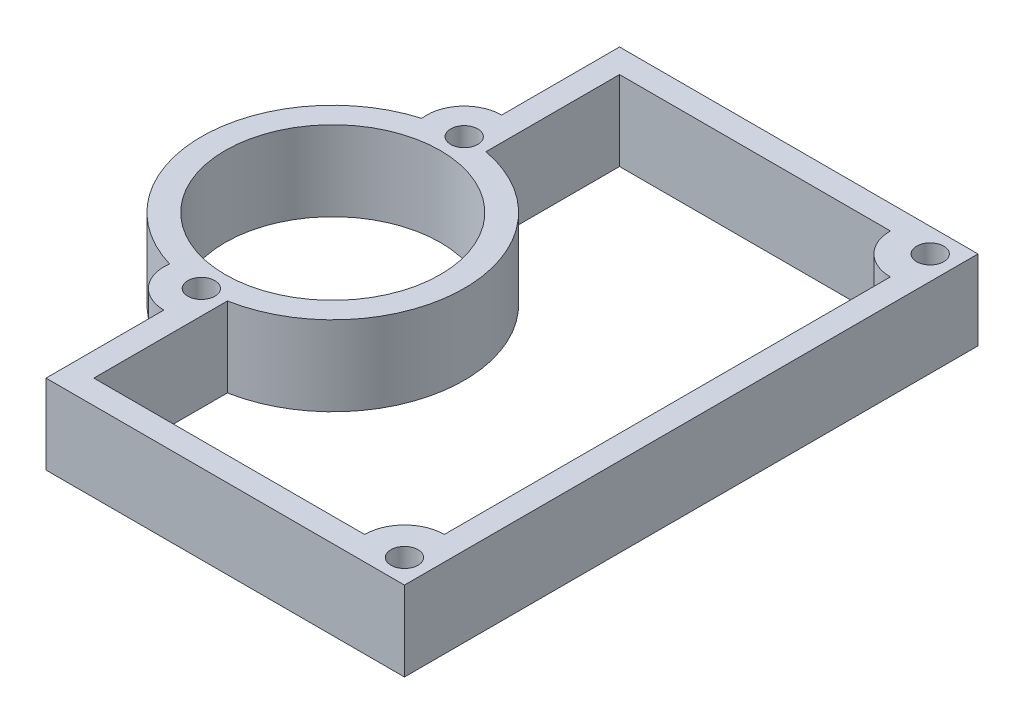
ISO-10303-21;
HEADER;
FILE_DESCRIPTION(('STEP AP214'),'2;1');
FILE_NAME('part.step','',(''),(''),'','','');
FILE_SCHEMA(('AUTOMOTIVE_DESIGN { 1 0 10303 214 1 1 1 1 }'));
ENDSEC;
DATA;
#1=APPLICATION_CONTEXT('core data for automotive mechanical design processes');
#2=APPLICATION_PROTOCOL_DEFINITION('international standard','automotive_design',2000,#1);
#3=PRODUCT_CONTEXT('',#1,'mechanical');
#4=PRODUCT('Part','Part','',(#3));
#5=PRODUCT_RELATED_PRODUCT_CATEGORY('part','',(#4));
#6=PRODUCT_DEFINITION_FORMATION('','',#4);
#7=PRODUCT_DEFINITION_CONTEXT('part definition',#1,'design');
#8=PRODUCT_DEFINITION('design','',#6,#7);
#9=PRODUCT_DEFINITION_SHAPE('','',#8);
#10=(LENGTH_UNIT() NAMED_UNIT(*) SI_UNIT(.MILLI.,.METRE.));
#11=(NAMED_UNIT(*) PLANE_ANGLE_UNIT() SI_UNIT($,.RADIAN.));
#12=(NAMED_UNIT(*) SI_UNIT($,.STERADIAN.) SOLID_ANGLE_UNIT());
#13=UNCERTAINTY_MEASURE_WITH_UNIT(LENGTH_MEASURE(1.E-05),#10,'distance_accuracy_value','');
#14=(GEOMETRIC_REPRESENTATION_CONTEXT(3) GLOBAL_UNCERTAINTY_ASSIGNED_CONTEXT((#13)) GLOBAL_UNIT_ASSIGNED_CONTEXT((#10,
#11,#12)) REPRESENTATION_CONTEXT('',''));
#15=CARTESIAN_POINT('',(0.,0.,0.));
#16=DIRECTION('',(0.,0.,1.));
#17=DIRECTION('',(1.,0.,0.));
#18=AXIS2_PLACEMENT_3D('',#15,#16,#17);
#19=CARTESIAN_POINT('',(0.,10.,16.5));
#20=DIRECTION('',(0.,-1.,0.));
#21=DIRECTION('',(0.,0.,-1.));
#22=AXIS2_PLACEMENT_3D('',#19,#20,#21);
#23=CYLINDRICAL_SURFACE('',#22,4.7);
#24=CARTESIAN_POINT('',(0.,0.,16.5));
#25=DIRECTION('',(0.,1.,0.));
#26=DIRECTION('',(0.,0.,1.));
#27=AXIS2_PLACEMENT_3D('',#24,#25,#26);
#28=CIRCLE('',#27,4.7);
#29=CARTESIAN_POINT('',(-4.65208681710722,0.,15.8306060606061));
#30=VERTEX_POINT('',#29);
#31=CARTESIAN_POINT('',(0.,0.,21.2));
#32=VERTEX_POINT('',#31);
#33=EDGE_CURVE('E220',#30,#32,#28,.T.);
#34=ORIENTED_EDGE('',*,*,#33,.T.);
#35=DIRECTION('',(0.,-1.,0.));
#36=VECTOR('',#35,1.);
#37=CARTESIAN_POINT('',(0.,10.,21.2));
#38=LINE('',#37,#36);
#39=CARTESIAN_POINT('',(0.,10.,21.2));
#40=VERTEX_POINT('',#39);
#41=EDGE_CURVE('E11',#40,#32,#38,.T.);
#42=ORIENTED_EDGE('',*,*,#41,.F.);
#43=CARTESIAN_POINT('',(0.,10.,16.5));
#44=DIRECTION('',(0.,1.,0.));
#45=DIRECTION('',(0.,0.,1.));
#46=AXIS2_PLACEMENT_3D('',#43,#44,#45);
#47=CIRCLE('',#46,4.7);
#48=CARTESIAN_POINT('',(-4.65208681710722,10.,15.8306060606061));
#49=VERTEX_POINT('',#48);
#50=EDGE_CURVE('E227',#49,#40,#47,.T.);
#51=ORIENTED_EDGE('',*,*,#50,.F.);
#52=DIRECTION('',(0.,-1.,0.));
#53=VECTOR('',#52,1.);
#54=CARTESIAN_POINT('',(-4.65208681710722,10.,15.8306060606061));
#55=LINE('',#54,#53);
#56=EDGE_CURVE('E268',#49,#30,#55,.T.);
#57=ORIENTED_EDGE('',*,*,#56,.T.);
#58=EDGE_LOOP('',(#34,#42,#51,#57));
#59=FACE_BOUND('',#58,.T.);
#60=ADVANCED_FACE('F42',(#59),#23,.T.);
#61=CARTESIAN_POINT('',(0.,10.,0.));
#62=DIRECTION('',(1.,0.,0.));
#63=DIRECTION('',(0.,0.,-1.));
#64=AXIS2_PLACEMENT_3D('',#61,#62,#63);
#65=PLANE('',#64);
#66=DIRECTION('',(0.,0.,1.));
#67=VECTOR('',#66,1.);
#68=CARTESIAN_POINT('',(0.,0.,0.));
#69=LINE('',#68,#67);
#70=CARTESIAN_POINT('',(0.,0.,36.));
#71=VERTEX_POINT('',#70);
#72=EDGE_CURVE('E272',#32,#71,#69,.T.);
#73=ORIENTED_EDGE('',*,*,#72,.T.);
#74=DIRECTION('',(0.,-1.,0.));
#75=VECTOR('',#74,1.);
#76=CARTESIAN_POINT('',(0.,10.,36.));
#77=LINE('',#76,#75);
#78=CARTESIAN_POINT('',(0.,10.,36.));
#79=VERTEX_POINT('',#78);
#80=EDGE_CURVE('E50',#79,#71,#77,.T.);
#81=ORIENTED_EDGE('',*,*,#80,.F.);
#82=DIRECTION('',(0.,0.,1.));
#83=VECTOR('',#82,1.);
#84=CARTESIAN_POINT('',(0.,10.,0.));
#85=LINE('',#84,#83);
#86=EDGE_CURVE('E231',#40,#79,#85,.T.);
#87=ORIENTED_EDGE('',*,*,#86,.F.);
#88=ORIENTED_EDGE('',*,*,#41,.T.);
#89=EDGE_LOOP('',(#73,#81,#87,#88));
#90=FACE_BOUND('',#89,.T.);
#91=ADVANCED_FACE('F351',(#90),#65,.F.);
#92=CARTESIAN_POINT('',(0.,10.,36.));
#93=DIRECTION('',(0.,0.,-1.));
#94=DIRECTION('',(-1.,0.,0.));
#95=AXIS2_PLACEMENT_3D('',#92,#93,#94);
#96=PLANE('',#95);
#97=DIRECTION('',(1.,0.,0.));
#98=VECTOR('',#97,1.);
#99=CARTESIAN_POINT('',(0.,0.,36.));
#100=LINE('',#99,#98);
#101=CARTESIAN_POINT('',(45.,0.,36.));
#102=VERTEX_POINT('',#101);
#103=EDGE_CURVE('E275',#71,#102,#100,.T.);
#104=ORIENTED_EDGE('',*,*,#103,.T.);
#105=DIRECTION('',(0.,-1.,0.));
#106=VECTOR('',#105,1.);
#107=CARTESIAN_POINT('',(45.,10.,36.));
#108=LINE('',#107,#106);
#109=CARTESIAN_POINT('',(45.,10.,36.));
#110=VERTEX_POINT('',#109);
#111=EDGE_CURVE('E323',#110,#102,#108,.T.);
#112=ORIENTED_EDGE('',*,*,#111,.F.);
#113=DIRECTION('',(1.,0.,0.));
#114=VECTOR('',#113,1.);
#115=CARTESIAN_POINT('',(0.,10.,36.));
#116=LINE('',#115,#114);
#117=EDGE_CURVE('E235',#79,#110,#116,.T.);
#118=ORIENTED_EDGE('',*,*,#117,.F.);
#119=ORIENTED_EDGE('',*,*,#80,.T.);
#120=EDGE_LOOP('',(#104,#112,#118,#119));
#121=FACE_BOUND('',#120,.T.);
#122=ADVANCED_FACE('F333',(#121),#96,.F.);
#123=CARTESIAN_POINT('',(45.,10.,0.));
#124=DIRECTION('',(-1.,0.,0.));
#125=DIRECTION('',(0.,0.,1.));
#126=AXIS2_PLACEMENT_3D('',#123,#124,#125);
#127=PLANE('',#126);
#128=DIRECTION('',(0.,0.,-1.));
#129=VECTOR('',#128,1.);
#130=CARTESIAN_POINT('',(45.,0.,0.));
#131=LINE('',#130,#129);
#132=CARTESIAN_POINT('',(45.,0.,-36.));
#133=VERTEX_POINT('',#132);
#134=EDGE_CURVE('E278',#102,#133,#131,.T.);
#135=ORIENTED_EDGE('',*,*,#134,.T.);
#136=DIRECTION('',(0.,-1.,0.));
#137=VECTOR('',#136,1.);
#138=CARTESIAN_POINT('',(45.,10.,-36.));
#139=LINE('',#138,#137);
#140=CARTESIAN_POINT('',(45.,10.,-36.));
#141=VERTEX_POINT('',#140);
#142=EDGE_CURVE('E320',#141,#133,#139,.T.);
#143=ORIENTED_EDGE('',*,*,#142,.F.);
#144=DIRECTION('',(0.,0.,-1.));
#145=VECTOR('',#144,1.);
#146=CARTESIAN_POINT('',(45.,10.,0.));
#147=LINE('',#146,#145);
#148=EDGE_CURVE('E238',#110,#141,#147,.T.);
#149=ORIENTED_EDGE('',*,*,#148,.F.);
#150=ORIENTED_EDGE('',*,*,#111,.T.);
#151=EDGE_LOOP('',(#135,#143,#149,#150));
#152=FACE_BOUND('',#151,.T.);
#153=ADVANCED_FACE('F342',(#152),#127,.F.);
#154=CARTESIAN_POINT('',(0.,10.,-36.));
#155=DIRECTION('',(0.,0.,-1.));
#156=DIRECTION('',(-1.,0.,0.));
#157=AXIS2_PLACEMENT_3D('',#154,#155,#156);
#158=PLANE('',#157);
#159=DIRECTION('',(1.,0.,0.));
#160=VECTOR('',#159,1.);
#161=CARTESIAN_POINT('',(0.,0.,-36.));
#162=LINE('',#161,#160);
#163=CARTESIAN_POINT('',(0.,0.,-36.));
#164=VERTEX_POINT('',#163);
#165=EDGE_CURVE('E282',#164,#133,#162,.T.);
#166=ORIENTED_EDGE('',*,*,#165,.F.);
#167=DIRECTION('',(0.,-1.,0.));
#168=VECTOR('',#167,1.);
#169=CARTESIAN_POINT('',(0.,10.,-36.));
#170=LINE('',#169,#168);
#171=CARTESIAN_POINT('',(0.,10.,-36.));
#172=VERTEX_POINT('',#171);
#173=EDGE_CURVE('E317',#172,#164,#170,.T.);
#174=ORIENTED_EDGE('',*,*,#173,.F.);
#175=DIRECTION('',(1.,0.,0.));
#176=VECTOR('',#175,1.);
#177=CARTESIAN_POINT('',(0.,10.,-36.));
#178=LINE('',#177,#176);
#179=EDGE_CURVE('E241',#172,#141,#178,.T.);
#180=ORIENTED_EDGE('',*,*,#179,.T.);
#181=ORIENTED_EDGE('',*,*,#142,.T.);
#182=EDGE_LOOP('',(#166,#174,#180,#181));
#183=FACE_BOUND('',#182,.T.);
#184=ADVANCED_FACE('F365',(#183),#158,.T.);
#185=CARTESIAN_POINT('',(0.,10.,0.));
#186=DIRECTION('',(-1.,0.,0.));
#187=DIRECTION('',(0.,0.,1.));
#188=AXIS2_PLACEMENT_3D('',#185,#186,#187);
#189=PLANE('',#188);
#190=DIRECTION('',(0.,0.,-1.));
#191=VECTOR('',#190,1.);
#192=CARTESIAN_POINT('',(0.,0.,0.));
#193=LINE('',#192,#191);
#194=CARTESIAN_POINT('',(0.,0.,-21.2));
#195=VERTEX_POINT('',#194);
#196=EDGE_CURVE('E286',#195,#164,#193,.T.);
#197=ORIENTED_EDGE('',*,*,#196,.F.);
#198=DIRECTION('',(0.,-1.,0.));
#199=VECTOR('',#198,1.);
#200=CARTESIAN_POINT('',(0.,10.,-21.2));
#201=LINE('',#200,#199);
#202=CARTESIAN_POINT('',(0.,10.,-21.2));
#203=VERTEX_POINT('',#202);
#204=EDGE_CURVE('E314',#203,#195,#201,.T.);
#205=ORIENTED_EDGE('',*,*,#204,.F.);
#206=DIRECTION('',(0.,0.,-1.));
#207=VECTOR('',#206,1.);
#208=CARTESIAN_POINT('',(0.,10.,0.));
#209=LINE('',#208,#207);
#210=EDGE_CURVE('E245',#203,#172,#209,.T.);
#211=ORIENTED_EDGE('',*,*,#210,.T.);
#212=ORIENTED_EDGE('',*,*,#173,.T.);
#213=EDGE_LOOP('',(#197,#205,#211,#212));
#214=FACE_BOUND('',#213,.T.);
#215=ADVANCED_FACE('F363',(#214),#189,.T.);
#216=CARTESIAN_POINT('',(0.,10.,-16.5));
#217=DIRECTION('',(0.,-1.,0.));
#218=DIRECTION('',(0.,0.,-1.));
#219=AXIS2_PLACEMENT_3D('',#216,#217,#218);
#220=CYLINDRICAL_SURFACE('',#219,4.7);
#221=CARTESIAN_POINT('',(0.,0.,-16.5));
#222=DIRECTION('',(0.,1.,0.));
#223=DIRECTION('',(0.,0.,1.));
#224=AXIS2_PLACEMENT_3D('',#221,#222,#223);
#225=CIRCLE('',#224,4.7);
#226=CARTESIAN_POINT('',(-4.6520868171072,0.,-15.8306060606061));
#227=VERTEX_POINT('',#226);
#228=EDGE_CURVE('E290',#227,#195,#225,.F.);
#229=ORIENTED_EDGE('',*,*,#228,.F.);
#230=DIRECTION('',(0.,-1.,0.));
#231=VECTOR('',#230,1.);
#232=CARTESIAN_POINT('',(-4.6520868171072,10.,-15.8306060606061));
#233=LINE('',#232,#231);
#234=CARTESIAN_POINT('',(-4.6520868171072,10.,-15.8306060606061));
#235=VERTEX_POINT('',#234);
#236=EDGE_CURVE('E311',#235,#227,#233,.T.);
#237=ORIENTED_EDGE('',*,*,#236,.F.);
#238=CARTESIAN_POINT('',(0.,10.,-16.5));
#239=DIRECTION('',(0.,1.,0.));
#240=DIRECTION('',(0.,0.,1.));
#241=AXIS2_PLACEMENT_3D('',#238,#239,#240);
#242=CIRCLE('',#241,4.7);
#243=EDGE_CURVE('E249',#235,#203,#242,.F.);
#244=ORIENTED_EDGE('',*,*,#243,.T.);
#245=ORIENTED_EDGE('',*,*,#204,.T.);
#246=EDGE_LOOP('',(#229,#237,#244,#245));
#247=FACE_BOUND('',#246,.T.);
#248=ADVANCED_FACE('F358',(#247),#220,.T.);
#249=CARTESIAN_POINT('',(0.,10.,16.5));
#250=DIRECTION('',(0.,-1.,0.));
#251=DIRECTION('',(0.,0.,-1.));
#252=AXIS2_PLACEMENT_3D('',#249,#250,#251);
#253=CYLINDRICAL_SURFACE('',#252,1.7);
#254=CARTESIAN_POINT('',(0.,10.,16.5));
#255=DIRECTION('',(0.,1.,0.));
#256=DIRECTION('',(0.,0.,1.));
#257=AXIS2_PLACEMENT_3D('',#254,#255,#256);
#258=CIRCLE('',#257,1.7);
#259=CARTESIAN_POINT('',(0.,10.,18.2));
#260=VERTEX_POINT('',#259);
#261=EDGE_CURVE('E260',#260,#260,#258,.F.);
#262=ORIENTED_EDGE('',*,*,#261,.F.);
#263=EDGE_LOOP('',(#262));
#264=FACE_BOUND('',#263,.T.);
#265=CARTESIAN_POINT('',(0.,0.,16.5));
#266=DIRECTION('',(0.,1.,0.));
#267=DIRECTION('',(0.,0.,1.));
#268=AXIS2_PLACEMENT_3D('',#265,#266,#267);
#269=CIRCLE('',#268,1.7);
#270=CARTESIAN_POINT('',(0.,0.,18.2));
#271=VERTEX_POINT('',#270);
#272=EDGE_CURVE('E301',#271,#271,#269,.F.);
#273=ORIENTED_EDGE('',*,*,#272,.T.);
#274=EDGE_LOOP('',(#273));
#275=FACE_BOUND('',#274,.T.);
#276=ADVANCED_FACE('F401',(#264,#275),#253,.F.);
#277=CARTESIAN_POINT('',(0.,10.,-16.5));
#278=DIRECTION('',(0.,-1.,0.));
#279=DIRECTION('',(0.,0.,-1.));
#280=AXIS2_PLACEMENT_3D('',#277,#278,#279);
#281=CYLINDRICAL_SURFACE('',#280,1.7);
#282=CARTESIAN_POINT('',(0.,10.,-16.5));
#283=DIRECTION('',(0.,1.,0.));
#284=DIRECTION('',(0.,0.,1.));
#285=AXIS2_PLACEMENT_3D('',#282,#283,#284);
#286=CIRCLE('',#285,1.7);
#287=CARTESIAN_POINT('',(0.,10.,-14.8));
#288=VERTEX_POINT('',#287);
#289=EDGE_CURVE('E256',#288,#288,#286,.T.);
#290=ORIENTED_EDGE('',*,*,#289,.T.);
#291=EDGE_LOOP('',(#290));
#292=FACE_BOUND('',#291,.T.);
#293=CARTESIAN_POINT('',(0.,0.,-16.5));
#294=DIRECTION('',(0.,1.,0.));
#295=DIRECTION('',(0.,0.,1.));
#296=AXIS2_PLACEMENT_3D('',#293,#294,#295);
#297=CIRCLE('',#296,1.7);
#298=CARTESIAN_POINT('',(0.,0.,-14.8));
#299=VERTEX_POINT('',#298);
#300=EDGE_CURVE('E297',#299,#299,#297,.T.);
#301=ORIENTED_EDGE('',*,*,#300,.F.);
#302=EDGE_LOOP('',(#301));
#303=FACE_BOUND('',#302,.T.);
#304=ADVANCED_FACE('F411',(#292,#303),#281,.F.);
#305=CARTESIAN_POINT('',(0.,10.,0.));
#306=DIRECTION('',(0.,-1.,0.));
#307=DIRECTION('',(0.,0.,-1.));
#308=AXIS2_PLACEMENT_3D('',#305,#306,#307);
#309=CYLINDRICAL_SURFACE('',#308,16.5);
#310=CARTESIAN_POINT('',(0.,0.,0.));
#311=DIRECTION('',(0.,1.,0.));
#312=DIRECTION('',(0.,0.,1.));
#313=AXIS2_PLACEMENT_3D('',#310,#311,#312);
#314=CIRCLE('',#313,16.5);
#315=EDGE_CURVE('E294',#227,#30,#314,.T.);
#316=ORIENTED_EDGE('',*,*,#315,.T.);
#317=ORIENTED_EDGE('',*,*,#56,.F.);
#318=CARTESIAN_POINT('',(0.,10.,0.));
#319=DIRECTION('',(0.,1.,0.));
#320=DIRECTION('',(0.,0.,1.));
#321=AXIS2_PLACEMENT_3D('',#318,#319,#320);
#322=CIRCLE('',#321,16.5);
#323=EDGE_CURVE('E253',#235,#49,#322,.T.);
#324=ORIENTED_EDGE('',*,*,#323,.F.);
#325=ORIENTED_EDGE('',*,*,#236,.T.);
#326=EDGE_LOOP('',(#316,#317,#324,#325));
#327=FACE_BOUND('',#326,.T.);
#328=ADVANCED_FACE('F419',(#327),#309,.T.);
#329=CARTESIAN_POINT('',(0.,10.,0.));
#330=DIRECTION('',(0.,-1.,0.));
#331=DIRECTION('',(0.,0.,-1.));
#332=AXIS2_PLACEMENT_3D('',#329,#330,#331);
#333=CYLINDRICAL_SURFACE('',#332,13.5);
#334=CARTESIAN_POINT('',(0.,10.,0.));
#335=DIRECTION('',(0.,1.,0.));
#336=DIRECTION('',(0.,0.,1.));
#337=AXIS2_PLACEMENT_3D('',#334,#335,#336);
#338=CIRCLE('',#337,13.5);
#339=CARTESIAN_POINT('',(0.,10.,13.5));
#340=VERTEX_POINT('',#339);
#341=EDGE_CURVE('E264',#340,#340,#338,.T.);
#342=ORIENTED_EDGE('',*,*,#341,.T.);
#343=EDGE_LOOP('',(#342));
#344=FACE_BOUND('',#343,.T.);
#345=CARTESIAN_POINT('',(0.,0.,0.));
#346=DIRECTION('',(0.,1.,0.));
#347=DIRECTION('',(0.,0.,1.));
#348=AXIS2_PLACEMENT_3D('',#345,#346,#347);
#349=CIRCLE('',#348,13.5);
#350=CARTESIAN_POINT('',(0.,0.,13.5));
#351=VERTEX_POINT('',#350);
#352=EDGE_CURVE('E232',#351,#351,#349,.T.);
#353=ORIENTED_EDGE('',*,*,#352,.F.);
#354=EDGE_LOOP('',(#353));
#355=FACE_BOUND('',#354,.T.);
#356=ADVANCED_FACE('F424',(#344,#355),#333,.F.);
#357=CARTESIAN_POINT('',(0.,10.,0.));
#358=DIRECTION('',(0.,1.,0.));
#359=DIRECTION('',(0.,0.,1.));
#360=AXIS2_PLACEMENT_3D('',#357,#358,#359);
#361=PLANE('',#360);
#362=CARTESIAN_POINT('',(42.,10.,-33.));
#363=DIRECTION('',(0.,1.,0.));
#364=DIRECTION('',(0.,0.,1.));
#365=AXIS2_PLACEMENT_3D('',#362,#363,#364);
#366=CIRCLE('',#365,1.7);
#367=CARTESIAN_POINT('',(42.,10.,-31.3));
#368=VERTEX_POINT('',#367);
#369=EDGE_CURVE('E654',#368,#368,#366,.T.);
#370=ORIENTED_EDGE('',*,*,#369,.F.);
#371=EDGE_LOOP('',(#370));
#372=FACE_BOUND('',#371,.T.);
#373=CARTESIAN_POINT('',(42.,10.,33.));
#374=DIRECTION('',(0.,1.,0.));
#375=DIRECTION('',(0.,0.,1.));
#376=AXIS2_PLACEMENT_3D('',#373,#374,#375);
#377=CIRCLE('',#376,1.7);
#378=CARTESIAN_POINT('',(42.,10.,34.7));
#379=VERTEX_POINT('',#378);
#380=EDGE_CURVE('E658',#379,#379,#377,.T.);
#381=ORIENTED_EDGE('',*,*,#380,.F.);
#382=EDGE_LOOP('',(#381));
#383=FACE_BOUND('',#382,.T.);
#384=DIRECTION('',(-1.,0.,0.));
#385=VECTOR('',#384,1.);
#386=CARTESIAN_POINT('',(3.,10.,-33.));
#387=LINE('',#386,#385);
#388=CARTESIAN_POINT('',(37.,10.,-33.));
#389=VERTEX_POINT('',#388);
#390=CARTESIAN_POINT('',(3.,10.,-33.));
#391=VERTEX_POINT('',#390);
#392=EDGE_CURVE('E187',#389,#391,#387,.T.);
#393=ORIENTED_EDGE('',*,*,#392,.F.);
#394=CARTESIAN_POINT('',(42.,10.,-33.));
#395=DIRECTION('',(0.,1.,0.));
#396=DIRECTION('',(0.,0.,1.));
#397=AXIS2_PLACEMENT_3D('',#394,#395,#396);
#398=CIRCLE('',#397,5.);
#399=CARTESIAN_POINT('',(42.,10.,-28.));
#400=VERTEX_POINT('',#399);
#401=EDGE_CURVE('E663',#389,#400,#398,.T.);
#402=ORIENTED_EDGE('',*,*,#401,.T.);
#403=DIRECTION('',(0.,0.,-1.));
#404=VECTOR('',#403,1.);
#405=CARTESIAN_POINT('',(42.,10.,-33.));
#406=LINE('',#405,#404);
#407=CARTESIAN_POINT('',(42.,10.,28.));
#408=VERTEX_POINT('',#407);
#409=EDGE_CURVE('E212',#408,#400,#406,.T.);
#410=ORIENTED_EDGE('',*,*,#409,.F.);
#411=CARTESIAN_POINT('',(42.,10.,33.));
#412=DIRECTION('',(0.,1.,0.));
#413=DIRECTION('',(0.,0.,-1.));
#414=AXIS2_PLACEMENT_3D('',#411,#412,#413);
#415=CIRCLE('',#414,5.);
#416=CARTESIAN_POINT('',(37.,10.,33.));
#417=VERTEX_POINT('',#416);
#418=EDGE_CURVE('E681',#408,#417,#415,.T.);
#419=ORIENTED_EDGE('',*,*,#418,.T.);
#420=DIRECTION('',(1.,0.,0.));
#421=VECTOR('',#420,1.);
#422=CARTESIAN_POINT('',(42.,10.,33.));
#423=LINE('',#422,#421);
#424=CARTESIAN_POINT('',(3.,10.,33.));
#425=VERTEX_POINT('',#424);
#426=EDGE_CURVE('E209',#425,#417,#423,.T.);
#427=ORIENTED_EDGE('',*,*,#426,.F.);
#428=DIRECTION('',(0.,0.,1.));
#429=VECTOR('',#428,1.);
#430=CARTESIAN_POINT('',(3.,10.,33.));
#431=LINE('',#430,#429);
#432=CARTESIAN_POINT('',(3.,10.,16.224980739588));
#433=VERTEX_POINT('',#432);
#434=EDGE_CURVE('E205',#433,#425,#431,.T.);
#435=ORIENTED_EDGE('',*,*,#434,.F.);
#436=CARTESIAN_POINT('',(0.,10.,0.));
#437=DIRECTION('',(0.,-1.,0.));
#438=DIRECTION('',(0.,0.,-1.));
#439=AXIS2_PLACEMENT_3D('',#436,#437,#438);
#440=CIRCLE('',#439,16.5);
#441=CARTESIAN_POINT('',(3.,10.,-16.2249807395879));
#442=VERTEX_POINT('',#441);
#443=EDGE_CURVE('E160',#442,#433,#440,.T.);
#444=ORIENTED_EDGE('',*,*,#443,.F.);
#445=DIRECTION('',(0.,0.,1.));
#446=VECTOR('',#445,1.);
#447=CARTESIAN_POINT('',(3.,10.,-16.2249807395879));
#448=LINE('',#447,#446);
#449=EDGE_CURVE('E182',#391,#442,#448,.T.);
#450=ORIENTED_EDGE('',*,*,#449,.F.);
#451=EDGE_LOOP('',(#393,#402,#410,#419,#427,#435,#444,#450));
#452=FACE_BOUND('',#451,.T.);
#453=ORIENTED_EDGE('',*,*,#50,.T.);
#454=ORIENTED_EDGE('',*,*,#86,.T.);
#455=ORIENTED_EDGE('',*,*,#117,.T.);
#456=ORIENTED_EDGE('',*,*,#148,.T.);
#457=ORIENTED_EDGE('',*,*,#179,.F.);
#458=ORIENTED_EDGE('',*,*,#210,.F.);
#459=ORIENTED_EDGE('',*,*,#243,.F.);
#460=ORIENTED_EDGE('',*,*,#323,.T.);
#461=EDGE_LOOP('',(#453,#454,#455,#456,#457,#458,#459,#460));
#462=FACE_BOUND('',#461,.T.);
#463=ORIENTED_EDGE('',*,*,#289,.F.);
#464=EDGE_LOOP('',(#463));
#465=FACE_BOUND('',#464,.T.);
#466=ORIENTED_EDGE('',*,*,#261,.T.);
#467=EDGE_LOOP('',(#466));
#468=FACE_BOUND('',#467,.T.);
#469=ORIENTED_EDGE('',*,*,#341,.F.);
#470=EDGE_LOOP('',(#469));
#471=FACE_BOUND('',#470,.T.);
#472=ADVANCED_FACE('F346',(#372,#383,#452,#462,#465,#468,#471),#361,.T.);
#473=CARTESIAN_POINT('',(0.,0.,0.));
#474=DIRECTION('',(0.,1.,0.));
#475=DIRECTION('',(0.,0.,1.));
#476=AXIS2_PLACEMENT_3D('',#473,#474,#475);
#477=PLANE('',#476);
#478=CARTESIAN_POINT('',(42.,0.,-33.));
#479=DIRECTION('',(0.,1.,0.));
#480=DIRECTION('',(0.,0.,1.));
#481=AXIS2_PLACEMENT_3D('',#478,#479,#480);
#482=CIRCLE('',#481,1.7);
#483=CARTESIAN_POINT('',(42.,0.,-31.3));
#484=VERTEX_POINT('',#483);
#485=EDGE_CURVE('E669',#484,#484,#482,.T.);
#486=ORIENTED_EDGE('',*,*,#485,.T.);
#487=EDGE_LOOP('',(#486));
#488=FACE_BOUND('',#487,.T.);
#489=CARTESIAN_POINT('',(42.,0.,33.));
#490=DIRECTION('',(0.,1.,0.));
#491=DIRECTION('',(0.,0.,1.));
#492=AXIS2_PLACEMENT_3D('',#489,#490,#491);
#493=CIRCLE('',#492,1.7);
#494=CARTESIAN_POINT('',(42.,0.,34.7));
#495=VERTEX_POINT('',#494);
#496=EDGE_CURVE('E712',#495,#495,#493,.T.);
#497=ORIENTED_EDGE('',*,*,#496,.T.);
#498=EDGE_LOOP('',(#497));
#499=FACE_BOUND('',#498,.T.);
#500=CARTESIAN_POINT('',(42.,0.,-33.));
#501=DIRECTION('',(0.,1.,0.));
#502=DIRECTION('',(0.,0.,1.));
#503=AXIS2_PLACEMENT_3D('',#500,#501,#502);
#504=CIRCLE('',#503,5.);
#505=CARTESIAN_POINT('',(37.,0.,-33.));
#506=VERTEX_POINT('',#505);
#507=CARTESIAN_POINT('',(42.,0.,-28.));
#508=VERTEX_POINT('',#507);
#509=EDGE_CURVE('E668',#506,#508,#504,.T.);
#510=ORIENTED_EDGE('',*,*,#509,.F.);
#511=DIRECTION('',(-1.,0.,0.));
#512=VECTOR('',#511,1.);
#513=CARTESIAN_POINT('',(3.,0.,-33.));
#514=LINE('',#513,#512);
#515=CARTESIAN_POINT('',(3.,0.,-33.));
#516=VERTEX_POINT('',#515);
#517=EDGE_CURVE('E57',#506,#516,#514,.T.);
#518=ORIENTED_EDGE('',*,*,#517,.T.);
#519=DIRECTION('',(0.,0.,1.));
#520=VECTOR('',#519,1.);
#521=CARTESIAN_POINT('',(3.,0.,-16.2249807395879));
#522=LINE('',#521,#520);
#523=CARTESIAN_POINT('',(3.,0.,-16.2249807395879));
#524=VERTEX_POINT('',#523);
#525=EDGE_CURVE('E166',#516,#524,#522,.T.);
#526=ORIENTED_EDGE('',*,*,#525,.T.);
#527=CARTESIAN_POINT('',(0.,0.,0.));
#528=DIRECTION('',(0.,-1.,0.));
#529=DIRECTION('',(0.,0.,-1.));
#530=AXIS2_PLACEMENT_3D('',#527,#528,#529);
#531=CIRCLE('',#530,16.5);
#532=CARTESIAN_POINT('',(3.,0.,16.224980739588));
#533=VERTEX_POINT('',#532);
#534=EDGE_CURVE('E157',#524,#533,#531,.T.);
#535=ORIENTED_EDGE('',*,*,#534,.T.);
#536=DIRECTION('',(0.,0.,1.));
#537=VECTOR('',#536,1.);
#538=CARTESIAN_POINT('',(3.,0.,33.));
#539=LINE('',#538,#537);
#540=CARTESIAN_POINT('',(3.,0.,33.));
#541=VERTEX_POINT('',#540);
#542=EDGE_CURVE('E170',#533,#541,#539,.T.);
#543=ORIENTED_EDGE('',*,*,#542,.T.);
#544=DIRECTION('',(1.,0.,0.));
#545=VECTOR('',#544,1.);
#546=CARTESIAN_POINT('',(42.,0.,33.));
#547=LINE('',#546,#545);
#548=CARTESIAN_POINT('',(37.,0.,33.));
#549=VERTEX_POINT('',#548);
#550=EDGE_CURVE('E175',#541,#549,#547,.T.);
#551=ORIENTED_EDGE('',*,*,#550,.T.);
#552=CARTESIAN_POINT('',(42.,0.,33.));
#553=DIRECTION('',(0.,1.,0.));
#554=DIRECTION('',(0.,0.,-1.));
#555=AXIS2_PLACEMENT_3D('',#552,#553,#554);
#556=CIRCLE('',#555,5.);
#557=CARTESIAN_POINT('',(42.,0.,28.));
#558=VERTEX_POINT('',#557);
#559=EDGE_CURVE('E684',#558,#549,#556,.T.);
#560=ORIENTED_EDGE('',*,*,#559,.F.);
#561=DIRECTION('',(0.,0.,-1.));
#562=VECTOR('',#561,1.);
#563=CARTESIAN_POINT('',(42.,0.,-33.));
#564=LINE('',#563,#562);
#565=EDGE_CURVE('E195',#558,#508,#564,.T.);
#566=ORIENTED_EDGE('',*,*,#565,.T.);
#567=EDGE_LOOP('',(#510,#518,#526,#535,#543,#551,#560,#566));
#568=FACE_BOUND('',#567,.T.);
#569=ORIENTED_EDGE('',*,*,#33,.F.);
#570=ORIENTED_EDGE('',*,*,#315,.F.);
#571=ORIENTED_EDGE('',*,*,#228,.T.);
#572=ORIENTED_EDGE('',*,*,#196,.T.);
#573=ORIENTED_EDGE('',*,*,#165,.T.);
#574=ORIENTED_EDGE('',*,*,#134,.F.);
#575=ORIENTED_EDGE('',*,*,#103,.F.);
#576=ORIENTED_EDGE('',*,*,#72,.F.);
#577=EDGE_LOOP('',(#569,#570,#571,#572,#573,#574,#575,#576));
#578=FACE_BOUND('',#577,.T.);
#579=ORIENTED_EDGE('',*,*,#300,.T.);
#580=EDGE_LOOP('',(#579));
#581=FACE_BOUND('',#580,.T.);
#582=ORIENTED_EDGE('',*,*,#272,.F.);
#583=EDGE_LOOP('',(#582));
#584=FACE_BOUND('',#583,.T.);
#585=ORIENTED_EDGE('',*,*,#352,.T.);
#586=EDGE_LOOP('',(#585));
#587=FACE_BOUND('',#586,.T.);
#588=ADVANCED_FACE('F178',(#488,#499,#568,#578,#581,#584,#587),#477,.F.);
#589=CARTESIAN_POINT('',(0.,0.,0.));
#590=DIRECTION('',(0.,1.,0.));
#591=DIRECTION('',(0.,0.,1.));
#592=AXIS2_PLACEMENT_3D('',#589,#590,#591);
#593=CYLINDRICAL_SURFACE('',#592,16.5);
#594=ORIENTED_EDGE('',*,*,#443,.T.);
#595=DIRECTION('',(0.,1.,0.));
#596=VECTOR('',#595,1.);
#597=CARTESIAN_POINT('',(3.,0.,16.224980739588));
#598=LINE('',#597,#596);
#599=EDGE_CURVE('E153',#533,#433,#598,.T.);
#600=ORIENTED_EDGE('',*,*,#599,.F.);
#601=ORIENTED_EDGE('',*,*,#534,.F.);
#602=DIRECTION('',(0.,1.,0.));
#603=VECTOR('',#602,1.);
#604=CARTESIAN_POINT('',(3.,0.,-16.2249807395879));
#605=LINE('',#604,#603);
#606=EDGE_CURVE('E217',#524,#442,#605,.T.);
#607=ORIENTED_EDGE('',*,*,#606,.T.);
#608=EDGE_LOOP('',(#594,#600,#601,#607));
#609=FACE_BOUND('',#608,.T.);
#610=ADVANCED_FACE('F155',(#609),#593,.T.);
#611=CARTESIAN_POINT('',(3.,0.,-16.2249807395879));
#612=DIRECTION('',(-1.,0.,0.));
#613=DIRECTION('',(0.,0.,1.));
#614=AXIS2_PLACEMENT_3D('',#611,#612,#613);
#615=PLANE('',#614);
#616=ORIENTED_EDGE('',*,*,#449,.T.);
#617=ORIENTED_EDGE('',*,*,#606,.F.);
#618=ORIENTED_EDGE('',*,*,#525,.F.);
#619=DIRECTION('',(0.,1.,0.));
#620=VECTOR('',#619,1.);
#621=CARTESIAN_POINT('',(3.,0.,-33.));
#622=LINE('',#621,#620);
#623=EDGE_CURVE('E221',#516,#391,#622,.T.);
#624=ORIENTED_EDGE('',*,*,#623,.T.);
#625=EDGE_LOOP('',(#616,#617,#618,#624));
#626=FACE_BOUND('',#625,.T.);
#627=ADVANCED_FACE('F458',(#626),#615,.F.);
#628=CARTESIAN_POINT('',(3.,0.,-33.));
#629=DIRECTION('',(0.,0.,-1.));
#630=DIRECTION('',(-1.,0.,0.));
#631=AXIS2_PLACEMENT_3D('',#628,#629,#630);
#632=PLANE('',#631);
#633=ORIENTED_EDGE('',*,*,#517,.F.);
#634=DIRECTION('',(0.,1.,0.));
#635=VECTOR('',#634,1.);
#636=CARTESIAN_POINT('',(37.,0.,-33.));
#637=LINE('',#636,#635);
#638=EDGE_CURVE('E61',#506,#389,#637,.T.);
#639=ORIENTED_EDGE('',*,*,#638,.T.);
#640=ORIENTED_EDGE('',*,*,#392,.T.);
#641=ORIENTED_EDGE('',*,*,#623,.F.);
#642=EDGE_LOOP('',(#633,#639,#640,#641));
#643=FACE_BOUND('',#642,.T.);
#644=ADVANCED_FACE('F468',(#643),#632,.F.);
#645=CARTESIAN_POINT('',(42.,0.,-33.));
#646=DIRECTION('',(1.,0.,0.));
#647=DIRECTION('',(0.,0.,-1.));
#648=AXIS2_PLACEMENT_3D('',#645,#646,#647);
#649=PLANE('',#648);
#650=ORIENTED_EDGE('',*,*,#409,.T.);
#651=DIRECTION('',(0.,1.,0.));
#652=VECTOR('',#651,1.);
#653=CARTESIAN_POINT('',(42.,0.,-28.));
#654=LINE('',#653,#652);
#655=EDGE_CURVE('E666',#508,#400,#654,.T.);
#656=ORIENTED_EDGE('',*,*,#655,.F.);
#657=ORIENTED_EDGE('',*,*,#565,.F.);
#658=DIRECTION('',(0.,1.,0.));
#659=VECTOR('',#658,1.);
#660=CARTESIAN_POINT('',(42.,0.,28.));
#661=LINE('',#660,#659);
#662=EDGE_CURVE('E190',#558,#408,#661,.T.);
#663=ORIENTED_EDGE('',*,*,#662,.T.);
#664=EDGE_LOOP('',(#650,#656,#657,#663));
#665=FACE_BOUND('',#664,.T.);
#666=ADVANCED_FACE('F479',(#665),#649,.F.);
#667=CARTESIAN_POINT('',(42.,0.,33.));
#668=DIRECTION('',(0.,0.,1.));
#669=DIRECTION('',(1.,0.,0.));
#670=AXIS2_PLACEMENT_3D('',#667,#668,#669);
#671=PLANE('',#670);
#672=ORIENTED_EDGE('',*,*,#426,.T.);
#673=DIRECTION('',(0.,1.,0.));
#674=VECTOR('',#673,1.);
#675=CARTESIAN_POINT('',(37.,0.,33.));
#676=LINE('',#675,#674);
#677=EDGE_CURVE('E206',#549,#417,#676,.T.);
#678=ORIENTED_EDGE('',*,*,#677,.F.);
#679=ORIENTED_EDGE('',*,*,#550,.F.);
#680=DIRECTION('',(0.,1.,0.));
#681=VECTOR('',#680,1.);
#682=CARTESIAN_POINT('',(3.,0.,33.));
#683=LINE('',#682,#681);
#684=EDGE_CURVE('E165',#541,#425,#683,.T.);
#685=ORIENTED_EDGE('',*,*,#684,.T.);
#686=EDGE_LOOP('',(#672,#678,#679,#685));
#687=FACE_BOUND('',#686,.T.);
#688=ADVANCED_FACE('F488',(#687),#671,.F.);
#689=CARTESIAN_POINT('',(3.,0.,33.));
#690=DIRECTION('',(-1.,0.,0.));
#691=DIRECTION('',(0.,0.,1.));
#692=AXIS2_PLACEMENT_3D('',#689,#690,#691);
#693=PLANE('',#692);
#694=ORIENTED_EDGE('',*,*,#434,.T.);
#695=ORIENTED_EDGE('',*,*,#684,.F.);
#696=ORIENTED_EDGE('',*,*,#542,.F.);
#697=ORIENTED_EDGE('',*,*,#599,.T.);
#698=EDGE_LOOP('',(#694,#695,#696,#697));
#699=FACE_BOUND('',#698,.T.);
#700=ADVANCED_FACE('F171',(#699),#693,.F.);
#701=CARTESIAN_POINT('',(42.,0.,33.));
#702=DIRECTION('',(0.,1.,0.));
#703=DIRECTION('',(0.,0.,1.));
#704=AXIS2_PLACEMENT_3D('',#701,#702,#703);
#705=CYLINDRICAL_SURFACE('',#704,5.);
#706=ORIENTED_EDGE('',*,*,#418,.F.);
#707=ORIENTED_EDGE('',*,*,#662,.F.);
#708=ORIENTED_EDGE('',*,*,#559,.T.);
#709=ORIENTED_EDGE('',*,*,#677,.T.);
#710=EDGE_LOOP('',(#706,#707,#708,#709));
#711=FACE_BOUND('',#710,.T.);
#712=ADVANCED_FACE('F507',(#711),#705,.T.);
#713=CARTESIAN_POINT('',(42.,0.,-33.));
#714=DIRECTION('',(0.,1.,0.));
#715=DIRECTION('',(0.,0.,1.));
#716=AXIS2_PLACEMENT_3D('',#713,#714,#715);
#717=CYLINDRICAL_SURFACE('',#716,5.);
#718=ORIENTED_EDGE('',*,*,#401,.F.);
#719=ORIENTED_EDGE('',*,*,#638,.F.);
#720=ORIENTED_EDGE('',*,*,#509,.T.);
#721=ORIENTED_EDGE('',*,*,#655,.T.);
#722=EDGE_LOOP('',(#718,#719,#720,#721));
#723=FACE_BOUND('',#722,.T.);
#724=ADVANCED_FACE('F515',(#723),#717,.T.);
#725=CARTESIAN_POINT('',(42.,0.,33.));
#726=DIRECTION('',(0.,1.,0.));
#727=DIRECTION('',(0.,0.,1.));
#728=AXIS2_PLACEMENT_3D('',#725,#726,#727);
#729=CYLINDRICAL_SURFACE('',#728,1.7);
#730=ORIENTED_EDGE('',*,*,#496,.F.);
#731=EDGE_LOOP('',(#730));
#732=FACE_BOUND('',#731,.T.);
#733=ORIENTED_EDGE('',*,*,#380,.T.);
#734=EDGE_LOOP('',(#733));
#735=FACE_BOUND('',#734,.T.);
#736=ADVANCED_FACE('F525',(#732,#735),#729,.F.);
#737=CARTESIAN_POINT('',(42.,0.,-33.));
#738=DIRECTION('',(0.,1.,0.));
#739=DIRECTION('',(0.,0.,1.));
#740=AXIS2_PLACEMENT_3D('',#737,#738,#739);
#741=CYLINDRICAL_SURFACE('',#740,1.7);
#742=ORIENTED_EDGE('',*,*,#485,.F.);
#743=EDGE_LOOP('',(#742));
#744=FACE_BOUND('',#743,.T.);
#745=ORIENTED_EDGE('',*,*,#369,.T.);
#746=EDGE_LOOP('',(#745));
#747=FACE_BOUND('',#746,.T.);
#748=ADVANCED_FACE('F536',(#744,#747),#741,.F.);
#749=CLOSED_SHELL('',(#60,#91,#122,#153,#184,#215,#248,#276,#304,#328,#356,#472,#588,#610,#627,
#644,#666,#688,#700,#712,#724,#736,#748));
#750=MANIFOLD_SOLID_BREP('B2',#749);
#751=ADVANCED_BREP_SHAPE_REPRESENTATION('',(#18,#750),#14);
#752=SHAPE_DEFINITION_REPRESENTATION(#9,#751);
ENDSEC;
END-ISO-10303-21;
